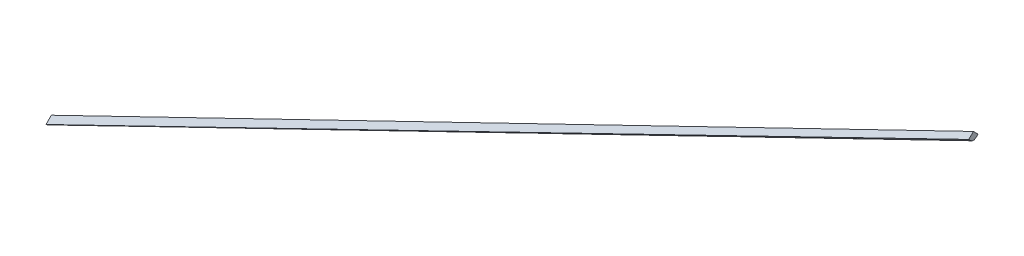
ISO-10303-21;
HEADER;
FILE_DESCRIPTION(('STEP AP214'),'2;1');
FILE_NAME('part.step','',(''),(''),'','','');
FILE_SCHEMA(('AUTOMOTIVE_DESIGN { 1 0 10303 214 1 1 1 1 }'));
ENDSEC;
DATA;
#1=APPLICATION_CONTEXT('core data for automotive mechanical design processes');
#2=APPLICATION_PROTOCOL_DEFINITION('international standard','automotive_design',2000,#1);
#3=PRODUCT_CONTEXT('',#1,'mechanical');
#4=PRODUCT('Part','Part','',(#3));
#5=PRODUCT_RELATED_PRODUCT_CATEGORY('part','',(#4));
#6=PRODUCT_DEFINITION_FORMATION('','',#4);
#7=PRODUCT_DEFINITION_CONTEXT('part definition',#1,'design');
#8=PRODUCT_DEFINITION('design','',#6,#7);
#9=PRODUCT_DEFINITION_SHAPE('','',#8);
#10=(LENGTH_UNIT() NAMED_UNIT(*) SI_UNIT(.MILLI.,.METRE.));
#11=(NAMED_UNIT(*) PLANE_ANGLE_UNIT() SI_UNIT($,.RADIAN.));
#12=(NAMED_UNIT(*) SI_UNIT($,.STERADIAN.) SOLID_ANGLE_UNIT());
#13=UNCERTAINTY_MEASURE_WITH_UNIT(LENGTH_MEASURE(1.E-05),#10,'distance_accuracy_value','');
#14=(GEOMETRIC_REPRESENTATION_CONTEXT(3) GLOBAL_UNCERTAINTY_ASSIGNED_CONTEXT((#13)) GLOBAL_UNIT_ASSIGNED_CONTEXT((#10,
#11,#12)) REPRESENTATION_CONTEXT('',''));
#15=CARTESIAN_POINT('',(0.,0.,0.));
#16=DIRECTION('',(0.,0.,1.));
#17=DIRECTION('',(1.,0.,0.));
#18=AXIS2_PLACEMENT_3D('',#15,#16,#17);
#19=CARTESIAN_POINT('',(0.,0.,0.));
#20=DIRECTION('',(-1.,0.,0.));
#21=DIRECTION('',(0.,0.,1.));
#22=AXIS2_PLACEMENT_3D('',#19,#20,#21);
#23=PLANE('',#22);
#24=DIRECTION('',(0.,-0.707106781186539,0.707106781186556));
#25=VECTOR('',#24,1.);
#26=CARTESIAN_POINT('',(0.,1.,0.));
#27=LINE('',#26,#25);
#28=CARTESIAN_POINT('',(0.,0.315862698021502,0.684137301919443));
#29=VERTEX_POINT('',#28);
#30=CARTESIAN_POINT('',(0.,1.,0.));
#31=VERTEX_POINT('',#30);
#32=EDGE_CURVE('E74',#29,#31,#27,.F.);
#33=ORIENTED_EDGE('',*,*,#32,.T.);
#34=DIRECTION('',(0.,-0.707106781186554,-0.707106781186541));
#35=VECTOR('',#34,1.);
#36=CARTESIAN_POINT('',(0.,1.,0.));
#37=LINE('',#36,#35);
#38=CARTESIAN_POINT('',(0.,0.31586269805103,-0.684137301948958));
#39=VERTEX_POINT('',#38);
#40=EDGE_CURVE('E92',#31,#39,#37,.T.);
#41=ORIENTED_EDGE('',*,*,#40,.T.);
#42=CARTESIAN_POINT('',(0.,114.4,0.));
#43=CARTESIAN_POINT('',(0.,114.4,0.0072838324299916));
#44=CARTESIAN_POINT('',(0.,114.211630690469,0.0218488366554333));
#45=CARTESIAN_POINT('',(0.,114.080118646882,0.0436282467660752));
#46=CARTESIAN_POINT('',(0.,113.796890954845,0.0795142857198553));
#47=CARTESIAN_POINT('',(0.,113.426193350975,0.128529824167782));
#48=CARTESIAN_POINT('',(0.,112.936855293923,0.189766940480201));
#49=CARTESIAN_POINT('',(0.,112.346166999731,0.26242898975721));
#50=CARTESIAN_POINT('',(0.,110.280049707971,0.510194469718378));
#51=CARTESIAN_POINT('',(0.,105.348652112069,1.03610984584126));
#52=CARTESIAN_POINT('',(0.,98.8040196091008,1.64696029330674));
#53=CARTESIAN_POINT('',(0.,89.5887480019146,2.43856623380089));
#54=CARTESIAN_POINT('',(0.,78.5982409417213,3.29258826974691));
#55=CARTESIAN_POINT('',(0.,64.5036725694726,4.21318410153266));
#56=CARTESIAN_POINT('',(0.,49.9099778334894,4.91417535466658));
#57=CARTESIAN_POINT('',(0.,38.9834810391131,5.16800984998526));
#58=CARTESIAN_POINT('',(0.,31.9372793334657,5.15962957711146));
#59=CARTESIAN_POINT('',(0.,28.6404540388475,5.11574905672803));
#60=CARTESIAN_POINT('',(0.,25.4659165086855,5.03886157181797));
#61=CARTESIAN_POINT('',(0.,21.5153111318161,4.88773266252852));
#62=CARTESIAN_POINT('',(0.,16.2443484888754,4.57614430828349));
#63=CARTESIAN_POINT('',(0.,11.3358377518641,4.06351264731328));
#64=CARTESIAN_POINT('',(0.,7.72888536307538,3.48002988666406));
#65=CARTESIAN_POINT('',(0.,5.96469851713171,3.13738551279787));
#66=CARTESIAN_POINT('',(0.,4.41708138247386,2.77256415689025));
#67=CARTESIAN_POINT('',(0.,3.09328338163604,2.37333821699482));
#68=CARTESIAN_POINT('',(0.,1.91416621401265,1.89926931885839));
#69=CARTESIAN_POINT('',(0.,1.05954476476886,1.39762010102772));
#70=CARTESIAN_POINT('',(0.,0.512892322559978,0.915140017273878));
#71=CARTESIAN_POINT('',(0.,0.262612740546847,0.629628981385082));
#72=CARTESIAN_POINT('',(0.,0.104439841482338,0.378528288285168));
#73=CARTESIAN_POINT('',(0.,0.0187876580989688,0.186587242264394));
#74=CARTESIAN_POINT('',(0.,-0.00614084997411463,0.));
#75=CARTESIAN_POINT('',(0.,0.0187876580989704,-0.186587242264419));
#76=CARTESIAN_POINT('',(0.,0.104439841482325,-0.378528288285144));
#77=CARTESIAN_POINT('',(0.,0.26261274054685,-0.629628981385088));
#78=CARTESIAN_POINT('',(0.,0.512892322560023,-0.915140017273927));
#79=CARTESIAN_POINT('',(0.,1.05954476476881,-1.39762010102767));
#80=CARTESIAN_POINT('',(0.,1.91416621401266,-1.8992693188584));
#81=CARTESIAN_POINT('',(0.,3.09328338163609,-2.37333821699484));
#82=CARTESIAN_POINT('',(0.,4.41708138247385,-2.77256415689025));
#83=CARTESIAN_POINT('',(0.,5.96469851713164,-3.13738551279786));
#84=CARTESIAN_POINT('',(0.,7.72888536307529,-3.48002988666405));
#85=CARTESIAN_POINT('',(0.,11.3358377518643,-4.06351264731332));
#86=CARTESIAN_POINT('',(0.,16.2443484888753,-4.57614430828348));
#87=CARTESIAN_POINT('',(0.,21.515311131816,-4.88773266252852));
#88=CARTESIAN_POINT('',(0.,25.4659165086855,-5.03886157181797));
#89=CARTESIAN_POINT('',(0.,28.6404540388475,-5.11574905672804));
#90=CARTESIAN_POINT('',(0.,31.9372793334656,-5.15962957711145));
#91=CARTESIAN_POINT('',(0.,38.9834810391131,-5.16800984998528));
#92=CARTESIAN_POINT('',(0.,49.9099778334897,-4.91417535466658));
#93=CARTESIAN_POINT('',(0.,64.5036725694725,-4.21318410153266));
#94=CARTESIAN_POINT('',(0.,78.5982409417211,-3.29258826974692));
#95=CARTESIAN_POINT('',(0.,89.5887480019146,-2.43856623380088));
#96=CARTESIAN_POINT('',(0.,98.8040196091008,-1.64696029330675));
#97=CARTESIAN_POINT('',(0.,105.348652112069,-1.03610984584126));
#98=CARTESIAN_POINT('',(0.,110.280049707971,-0.510194469718387));
#99=CARTESIAN_POINT('',(0.,112.346166999731,-0.262428989757209));
#100=CARTESIAN_POINT('',(0.,112.936855293923,-0.189766940480202));
#101=CARTESIAN_POINT('',(0.,113.426193350975,-0.12852982416778));
#102=CARTESIAN_POINT('',(0.,113.796890954845,-0.0795142857198586));
#103=CARTESIAN_POINT('',(0.,114.080118646882,-0.043628246766073));
#104=CARTESIAN_POINT('',(0.,114.211630690469,-0.0218488366554367));
#105=CARTESIAN_POINT('',(0.,114.4,-0.00728383242999128));
#106=CARTESIAN_POINT('',(0.,114.4,0.));
#107=B_SPLINE_CURVE_WITH_KNOTS('',3,(#42,#43,#44,#45,#46,#47,#48,#49,#50,#51,#52,#53,#54,#55,
#56,#57,#58,#59,#60,#61,#62,#63,#64,#65,#66,#67,#68,#69,#70,#71,#72,#73,#74,#75,#76,#77,#78,#79,
#80,#81,#82,#83,#84,#85,#86,#87,#88,#89,#90,#91,#92,#93,#94,#95,#96,#97,#98,#99,#100,#101,#102,
#103,#104,#105,#106),.UNSPECIFIED.,.T.,.F.,(4,1,1,1,1,1,1,1,1,1,1,1,1,1,1,1,1,1,1,1,1,1,1,1,1,1,
1,1,1,1,1,1,1,1,1,1,1,1,1,1,1,1,1,1,1,1,1,1,1,1,1,1,1,1,1,1,1,1,1,1,1,1,4),(0.,
0.000711185839146075,0.00142211189669677,0.00213325230730564,0.00425158120835251,
0.00636919832710723,0.00848752581630524,0.0119730784810977,0.0333165732602391,0.072750532853801,
0.097133324863051,0.153150736130299,0.215572756141474,0.280129489501461,0.342436877180773,
0.35716003719228,0.371419982611637,0.385154319352995,0.398301185339692,0.422640862362832,
0.453555830037826,0.462206438132531,0.469975829256052,0.476836911130722,0.482800105251618,
0.487877314409996,0.493276037135274,0.495568649395588,0.497302284253286,0.498179926351266,
0.499405098860122,0.5,0.500594901139878,0.501820073648735,0.502697715746714,0.504431350604412,
0.506723962864726,0.512122685590004,0.517199894748382,0.523163088869278,0.530024170743948,
0.537793561867469,0.546444169962174,0.577359137637168,0.601698814660308,0.614845680647005,
0.628580017388363,0.64283996280772,0.657563122819227,0.719870510498539,0.784427243858526,
0.846849263869701,0.902866675136949,0.927249467146199,0.966683426739761,0.988026921518902,
0.991512474183695,0.993630801672893,0.995748418791648,0.997866747692695,0.998577888103303,
0.999288814160854,1.),.UNSPECIFIED.);
#108=EDGE_CURVE('E66',#29,#39,#107,.T.);
#109=ORIENTED_EDGE('',*,*,#108,.F.);
#110=EDGE_LOOP('',(#33,#41,#109));
#111=FACE_BOUND('',#110,.T.);
#112=ADVANCED_FACE('F54',(#111),#23,.T.);
#113=CARTESIAN_POINT('',(118.,57.2,0.));
#114=DIRECTION('',(-1.,0.,0.));
#115=DIRECTION('',(0.,0.,1.));
#116=AXIS2_PLACEMENT_3D('',#113,#114,#115);
#117=PLANE('',#116);
#118=DIRECTION('',(0.,-0.707106781186554,-0.707106781186541));
#119=VECTOR('',#118,1.);
#120=CARTESIAN_POINT('',(118.,58.2,0.));
#121=LINE('',#120,#119);
#122=CARTESIAN_POINT('',(118.,58.2,0.));
#123=VERTEX_POINT('',#122);
#124=CARTESIAN_POINT('',(118.,57.6105345780877,-0.589465421912309));
#125=VERTEX_POINT('',#124);
#126=EDGE_CURVE('E104',#123,#125,#121,.T.);
#127=ORIENTED_EDGE('',*,*,#126,.F.);
#128=DIRECTION('',(0.,-0.707106781186539,0.707106781186556));
#129=VECTOR('',#128,1.);
#130=CARTESIAN_POINT('',(118.,58.2,0.));
#131=LINE('',#130,#129);
#132=CARTESIAN_POINT('',(118.,57.6105345780877,0.589465421912323));
#133=VERTEX_POINT('',#132);
#134=EDGE_CURVE('E12',#133,#123,#131,.F.);
#135=ORIENTED_EDGE('',*,*,#134,.F.);
#136=CARTESIAN_POINT('',(118.,114.4,0.));
#137=CARTESIAN_POINT('',(118.,114.4,0.0036419162149958));
#138=CARTESIAN_POINT('',(118.,114.305815345234,0.0109244183277166));
#139=CARTESIAN_POINT('',(118.,114.240059323441,0.0218141233830376));
#140=CARTESIAN_POINT('',(118.,114.098445477423,0.0397571428599277));
#141=CARTESIAN_POINT('',(118.,113.913096675488,0.0642649120838911));
#142=CARTESIAN_POINT('',(118.,113.668427646962,0.0948834702401005));
#143=CARTESIAN_POINT('',(118.,113.373083499866,0.131214494878605));
#144=CARTESIAN_POINT('',(118.,112.340024853985,0.255097234859189));
#145=CARTESIAN_POINT('',(118.,109.874326056034,0.518054922920632));
#146=CARTESIAN_POINT('',(118.,106.60200980455,0.823480146653369));
#147=CARTESIAN_POINT('',(118.,101.994374000957,1.21928311690045));
#148=CARTESIAN_POINT('',(118.,96.4991204708606,1.64629413487346));
#149=CARTESIAN_POINT('',(118.,89.4518362847363,2.10659205076633));
#150=CARTESIAN_POINT('',(118.,82.1549889167447,2.45708767733329));
#151=CARTESIAN_POINT('',(118.,76.6917405195565,2.58400492499263));
#152=CARTESIAN_POINT('',(118.,73.1686396667329,2.57981478855573));
#153=CARTESIAN_POINT('',(118.,71.5202270194238,2.55787452836402));
#154=CARTESIAN_POINT('',(118.,69.9329582543428,2.51943078590898));
#155=CARTESIAN_POINT('',(118.,67.957655565908,2.44386633126426));
#156=CARTESIAN_POINT('',(118.,65.3221742444377,2.28807215414175));
#157=CARTESIAN_POINT('',(118.,62.8679188759321,2.03175632365664));
#158=CARTESIAN_POINT('',(118.,61.0644426815377,1.74001494333203));
#159=CARTESIAN_POINT('',(118.,60.1823492585659,1.56869275639894));
#160=CARTESIAN_POINT('',(118.,59.4085406912369,1.38628207844513));
#161=CARTESIAN_POINT('',(118.,58.746641690818,1.18666910849741));
#162=CARTESIAN_POINT('',(118.,58.1570831070063,0.949634659429197));
#163=CARTESIAN_POINT('',(118.,57.7297723823844,0.69881005051386));
#164=CARTESIAN_POINT('',(118.,57.45644616128,0.457570008636939));
#165=CARTESIAN_POINT('',(118.,57.3313063702734,0.314814490692541));
#166=CARTESIAN_POINT('',(118.,57.2522199207412,0.189264144142584));
#167=CARTESIAN_POINT('',(118.,57.2093938290495,0.0932936211321971));
#168=CARTESIAN_POINT('',(118.,57.1969295750129,0.));
#169=CARTESIAN_POINT('',(118.,57.2093938290495,-0.0932936211322096));
#170=CARTESIAN_POINT('',(118.,57.2522199207412,-0.189264144142572));
#171=CARTESIAN_POINT('',(118.,57.3313063702734,-0.314814490692544));
#172=CARTESIAN_POINT('',(118.,57.45644616128,-0.457570008636963));
#173=CARTESIAN_POINT('',(118.,57.7297723823844,-0.698810050513834));
#174=CARTESIAN_POINT('',(118.,58.1570831070064,-0.9496346594292));
#175=CARTESIAN_POINT('',(118.,58.746641690818,-1.18666910849742));
#176=CARTESIAN_POINT('',(118.,59.4085406912369,-1.38628207844513));
#177=CARTESIAN_POINT('',(118.,60.1823492585658,-1.56869275639893));
#178=CARTESIAN_POINT('',(118.,61.0644426815376,-1.74001494333202));
#179=CARTESIAN_POINT('',(118.,62.8679188759322,-2.03175632365666));
#180=CARTESIAN_POINT('',(118.,65.3221742444378,-2.28807215414174));
#181=CARTESIAN_POINT('',(118.,67.957655565908,-2.44386633126426));
#182=CARTESIAN_POINT('',(118.,69.9329582543428,-2.51943078590898));
#183=CARTESIAN_POINT('',(118.,71.5202270194237,-2.55787452836402));
#184=CARTESIAN_POINT('',(118.,73.1686396667328,-2.57981478855572));
#185=CARTESIAN_POINT('',(118.,76.6917405195565,-2.58400492499264));
#186=CARTESIAN_POINT('',(118.,82.1549889167448,-2.45708767733329));
#187=CARTESIAN_POINT('',(118.,89.4518362847363,-2.10659205076633));
#188=CARTESIAN_POINT('',(118.,96.4991204708607,-1.64629413487346));
#189=CARTESIAN_POINT('',(118.,101.994374000957,-1.21928311690044));
#190=CARTESIAN_POINT('',(118.,106.60200980455,-0.823480146653373));
#191=CARTESIAN_POINT('',(118.,109.874326056035,-0.51805492292063));
#192=CARTESIAN_POINT('',(118.,112.340024853985,-0.255097234859193));
#193=CARTESIAN_POINT('',(118.,113.373083499866,-0.131214494878604));
#194=CARTESIAN_POINT('',(118.,113.668427646961,-0.0948834702401012));
#195=CARTESIAN_POINT('',(118.,113.913096675488,-0.0642649120838899));
#196=CARTESIAN_POINT('',(118.,114.098445477423,-0.0397571428599293));
#197=CARTESIAN_POINT('',(118.,114.240059323441,-0.0218141233830365));
#198=CARTESIAN_POINT('',(118.,114.305815345234,-0.0109244183277184));
#199=CARTESIAN_POINT('',(118.,114.4,-0.00364191621499564));
#200=CARTESIAN_POINT('',(118.,114.4,0.));
#201=B_SPLINE_CURVE_WITH_KNOTS('',3,(#136,#137,#138,#139,#140,#141,#142,#143,#144,#145,#146,
#147,#148,#149,#150,#151,#152,#153,#154,#155,#156,#157,#158,#159,#160,#161,#162,#163,#164,#165,
#166,#167,#168,#169,#170,#171,#172,#173,#174,#175,#176,#177,#178,#179,#180,#181,#182,#183,#184,
#185,#186,#187,#188,#189,#190,#191,#192,#193,#194,#195,#196,#197,#198,#199,#200),.UNSPECIFIED.,
.T.,.F.,(4,1,1,1,1,1,1,1,1,1,1,1,1,1,1,1,1,1,1,1,1,1,1,1,1,1,1,1,1,1,1,1,1,1,1,1,1,1,1,1,1,1,1,
1,1,1,1,1,1,1,1,1,1,1,1,1,1,1,1,1,1,1,4),(0.,0.000711185839146075,0.00142211189669677,
0.00213325230730564,0.00425158120835251,0.00636919832710723,0.00848752581630524,
0.0119730784810977,0.0333165732602391,0.072750532853801,0.097133324863051,0.153150736130299,
0.215572756141474,0.280129489501461,0.342436877180773,0.35716003719228,0.371419982611637,
0.385154319352995,0.398301185339692,0.422640862362832,0.453555830037826,0.462206438132531,
0.469975829256052,0.476836911130722,0.482800105251618,0.487877314409996,0.493276037135274,
0.495568649395588,0.497302284253286,0.498179926351266,0.499405098860122,0.5,0.500594901139878,
0.501820073648735,0.502697715746714,0.504431350604412,0.506723962864726,0.512122685590004,
0.517199894748382,0.523163088869278,0.530024170743948,0.537793561867469,0.546444169962174,
0.577359137637168,0.601698814660308,0.614845680647005,0.628580017388363,0.64283996280772,
0.657563122819227,0.719870510498539,0.784427243858526,0.846849263869701,0.902866675136949,
0.927249467146199,0.966683426739761,0.988026921518902,0.991512474183695,0.993630801672893,
0.995748418791648,0.997866747692695,0.998577888103303,0.999288814160854,1.),.UNSPECIFIED.);
#202=EDGE_CURVE('E58',#133,#125,#201,.T.);
#203=ORIENTED_EDGE('',*,*,#202,.T.);
#204=EDGE_LOOP('',(#127,#135,#203));
#205=FACE_BOUND('',#204,.T.);
#206=ADVANCED_FACE('F56',(#205),#117,.F.);
#207=CARTESIAN_POINT('',(0.,114.4,0.));
#208=CARTESIAN_POINT('',(118.,114.4,0.));
#209=CARTESIAN_POINT('',(0.,114.4,0.0072838324299916));
#210=CARTESIAN_POINT('',(118.,114.4,0.0036419162149958));
#211=CARTESIAN_POINT('',(0.,114.211630690469,0.0218488366554333));
#212=CARTESIAN_POINT('',(118.,114.305815345234,0.0109244183277166));
#213=CARTESIAN_POINT('',(0.,114.080118646882,0.0436282467660752));
#214=CARTESIAN_POINT('',(118.,114.240059323441,0.0218141233830376));
#215=CARTESIAN_POINT('',(0.,113.796890954845,0.0795142857198553));
#216=CARTESIAN_POINT('',(118.,114.098445477423,0.0397571428599277));
#217=CARTESIAN_POINT('',(0.,113.426193350975,0.128529824167782));
#218=CARTESIAN_POINT('',(118.,113.913096675488,0.0642649120838911));
#219=CARTESIAN_POINT('',(0.,112.936855293923,0.189766940480201));
#220=CARTESIAN_POINT('',(118.,113.668427646962,0.0948834702401005));
#221=CARTESIAN_POINT('',(0.,112.346166999731,0.26242898975721));
#222=CARTESIAN_POINT('',(118.,113.373083499866,0.131214494878605));
#223=CARTESIAN_POINT('',(0.,110.280049707971,0.510194469718378));
#224=CARTESIAN_POINT('',(118.,112.340024853985,0.255097234859189));
#225=CARTESIAN_POINT('',(0.,105.348652112069,1.03610984584126));
#226=CARTESIAN_POINT('',(118.,109.874326056034,0.518054922920632));
#227=CARTESIAN_POINT('',(0.,98.8040196091008,1.64696029330674));
#228=CARTESIAN_POINT('',(118.,106.60200980455,0.823480146653369));
#229=CARTESIAN_POINT('',(0.,89.5887480019146,2.43856623380089));
#230=CARTESIAN_POINT('',(118.,101.994374000957,1.21928311690045));
#231=CARTESIAN_POINT('',(0.,78.5982409417213,3.29258826974691));
#232=CARTESIAN_POINT('',(118.,96.4991204708606,1.64629413487346));
#233=CARTESIAN_POINT('',(0.,64.5036725694726,4.21318410153266));
#234=CARTESIAN_POINT('',(118.,89.4518362847363,2.10659205076633));
#235=CARTESIAN_POINT('',(0.,49.9099778334894,4.91417535466658));
#236=CARTESIAN_POINT('',(118.,82.1549889167447,2.45708767733329));
#237=CARTESIAN_POINT('',(0.,38.9834810391131,5.16800984998526));
#238=CARTESIAN_POINT('',(118.,76.6917405195565,2.58400492499263));
#239=CARTESIAN_POINT('',(0.,31.9372793334657,5.15962957711146));
#240=CARTESIAN_POINT('',(118.,73.1686396667329,2.57981478855573));
#241=CARTESIAN_POINT('',(0.,28.6404540388475,5.11574905672803));
#242=CARTESIAN_POINT('',(118.,71.5202270194238,2.55787452836402));
#243=CARTESIAN_POINT('',(0.,25.4659165086855,5.03886157181797));
#244=CARTESIAN_POINT('',(118.,69.9329582543428,2.51943078590898));
#245=CARTESIAN_POINT('',(0.,21.5153111318161,4.88773266252852));
#246=CARTESIAN_POINT('',(118.,67.957655565908,2.44386633126426));
#247=CARTESIAN_POINT('',(0.,16.2443484888754,4.57614430828349));
#248=CARTESIAN_POINT('',(118.,65.3221742444377,2.28807215414175));
#249=CARTESIAN_POINT('',(0.,11.3358377518641,4.06351264731328));
#250=CARTESIAN_POINT('',(118.,62.8679188759321,2.03175632365664));
#251=CARTESIAN_POINT('',(0.,7.72888536307538,3.48002988666406));
#252=CARTESIAN_POINT('',(118.,61.0644426815377,1.74001494333203));
#253=CARTESIAN_POINT('',(0.,5.96469851713171,3.13738551279787));
#254=CARTESIAN_POINT('',(118.,60.1823492585659,1.56869275639894));
#255=CARTESIAN_POINT('',(0.,4.41708138247386,2.77256415689025));
#256=CARTESIAN_POINT('',(118.,59.4085406912369,1.38628207844513));
#257=CARTESIAN_POINT('',(0.,3.09328338163604,2.37333821699482));
#258=CARTESIAN_POINT('',(118.,58.746641690818,1.18666910849741));
#259=CARTESIAN_POINT('',(0.,1.91416621401265,1.89926931885839));
#260=CARTESIAN_POINT('',(118.,58.1570831070063,0.949634659429197));
#261=CARTESIAN_POINT('',(0.,1.05954476476886,1.39762010102772));
#262=CARTESIAN_POINT('',(118.,57.7297723823844,0.69881005051386));
#263=CARTESIAN_POINT('',(0.,0.512892322559978,0.915140017273878));
#264=CARTESIAN_POINT('',(118.,57.45644616128,0.457570008636939));
#265=CARTESIAN_POINT('',(0.,0.262612740546847,0.629628981385082));
#266=CARTESIAN_POINT('',(118.,57.3313063702734,0.314814490692541));
#267=CARTESIAN_POINT('',(0.,0.104439841482338,0.378528288285168));
#268=CARTESIAN_POINT('',(118.,57.2522199207412,0.189264144142584));
#269=CARTESIAN_POINT('',(0.,0.0187876580989688,0.186587242264394));
#270=CARTESIAN_POINT('',(118.,57.2093938290495,0.0932936211321971));
#271=CARTESIAN_POINT('',(0.,-0.00614084997411463,0.));
#272=CARTESIAN_POINT('',(118.,57.1969295750129,0.));
#273=CARTESIAN_POINT('',(0.,0.0187876580989704,-0.186587242264419));
#274=CARTESIAN_POINT('',(118.,57.2093938290495,-0.0932936211322096));
#275=CARTESIAN_POINT('',(0.,0.104439841482325,-0.378528288285144));
#276=CARTESIAN_POINT('',(118.,57.2522199207412,-0.189264144142572));
#277=CARTESIAN_POINT('',(0.,0.26261274054685,-0.629628981385088));
#278=CARTESIAN_POINT('',(118.,57.3313063702734,-0.314814490692544));
#279=CARTESIAN_POINT('',(0.,0.512892322560023,-0.915140017273927));
#280=CARTESIAN_POINT('',(118.,57.45644616128,-0.457570008636963));
#281=CARTESIAN_POINT('',(0.,1.05954476476881,-1.39762010102767));
#282=CARTESIAN_POINT('',(118.,57.7297723823844,-0.698810050513834));
#283=CARTESIAN_POINT('',(0.,1.91416621401266,-1.8992693188584));
#284=CARTESIAN_POINT('',(118.,58.1570831070064,-0.9496346594292));
#285=CARTESIAN_POINT('',(0.,3.09328338163609,-2.37333821699484));
#286=CARTESIAN_POINT('',(118.,58.746641690818,-1.18666910849742));
#287=CARTESIAN_POINT('',(0.,4.41708138247385,-2.77256415689025));
#288=CARTESIAN_POINT('',(118.,59.4085406912369,-1.38628207844513));
#289=CARTESIAN_POINT('',(0.,5.96469851713164,-3.13738551279786));
#290=CARTESIAN_POINT('',(118.,60.1823492585658,-1.56869275639893));
#291=CARTESIAN_POINT('',(0.,7.72888536307529,-3.48002988666405));
#292=CARTESIAN_POINT('',(118.,61.0644426815376,-1.74001494333202));
#293=CARTESIAN_POINT('',(0.,11.3358377518643,-4.06351264731332));
#294=CARTESIAN_POINT('',(118.,62.8679188759322,-2.03175632365666));
#295=CARTESIAN_POINT('',(0.,16.2443484888753,-4.57614430828348));
#296=CARTESIAN_POINT('',(118.,65.3221742444378,-2.28807215414174));
#297=CARTESIAN_POINT('',(0.,21.515311131816,-4.88773266252852));
#298=CARTESIAN_POINT('',(118.,67.957655565908,-2.44386633126426));
#299=CARTESIAN_POINT('',(0.,25.4659165086855,-5.03886157181797));
#300=CARTESIAN_POINT('',(118.,69.9329582543428,-2.51943078590898));
#301=CARTESIAN_POINT('',(0.,28.6404540388475,-5.11574905672804));
#302=CARTESIAN_POINT('',(118.,71.5202270194237,-2.55787452836402));
#303=CARTESIAN_POINT('',(0.,31.9372793334656,-5.15962957711145));
#304=CARTESIAN_POINT('',(118.,73.1686396667328,-2.57981478855572));
#305=CARTESIAN_POINT('',(0.,38.9834810391131,-5.16800984998528));
#306=CARTESIAN_POINT('',(118.,76.6917405195565,-2.58400492499264));
#307=CARTESIAN_POINT('',(0.,49.9099778334897,-4.91417535466658));
#308=CARTESIAN_POINT('',(118.,82.1549889167448,-2.45708767733329));
#309=CARTESIAN_POINT('',(0.,64.5036725694725,-4.21318410153266));
#310=CARTESIAN_POINT('',(118.,89.4518362847363,-2.10659205076633));
#311=CARTESIAN_POINT('',(0.,78.5982409417211,-3.29258826974692));
#312=CARTESIAN_POINT('',(118.,96.4991204708607,-1.64629413487346));
#313=CARTESIAN_POINT('',(0.,89.5887480019146,-2.43856623380088));
#314=CARTESIAN_POINT('',(118.,101.994374000957,-1.21928311690044));
#315=CARTESIAN_POINT('',(0.,98.8040196091008,-1.64696029330675));
#316=CARTESIAN_POINT('',(118.,106.60200980455,-0.823480146653373));
#317=CARTESIAN_POINT('',(0.,105.348652112069,-1.03610984584126));
#318=CARTESIAN_POINT('',(118.,109.874326056035,-0.51805492292063));
#319=CARTESIAN_POINT('',(0.,110.280049707971,-0.510194469718387));
#320=CARTESIAN_POINT('',(118.,112.340024853985,-0.255097234859193));
#321=CARTESIAN_POINT('',(0.,112.346166999731,-0.262428989757209));
#322=CARTESIAN_POINT('',(118.,113.373083499866,-0.131214494878604));
#323=CARTESIAN_POINT('',(0.,112.936855293923,-0.189766940480202));
#324=CARTESIAN_POINT('',(118.,113.668427646961,-0.0948834702401012));
#325=CARTESIAN_POINT('',(0.,113.426193350975,-0.12852982416778));
#326=CARTESIAN_POINT('',(118.,113.913096675488,-0.0642649120838899));
#327=CARTESIAN_POINT('',(0.,113.796890954845,-0.0795142857198586));
#328=CARTESIAN_POINT('',(118.,114.098445477423,-0.0397571428599293));
#329=CARTESIAN_POINT('',(0.,114.080118646882,-0.043628246766073));
#330=CARTESIAN_POINT('',(118.,114.240059323441,-0.0218141233830365));
#331=CARTESIAN_POINT('',(0.,114.211630690469,-0.0218488366554367));
#332=CARTESIAN_POINT('',(118.,114.305815345234,-0.0109244183277184));
#333=CARTESIAN_POINT('',(0.,114.4,-0.00728383242999128));
#334=CARTESIAN_POINT('',(118.,114.4,-0.00364191621499564));
#335=CARTESIAN_POINT('',(0.,114.4,0.));
#336=CARTESIAN_POINT('',(118.,114.4,0.));
#337=B_SPLINE_SURFACE_WITH_KNOTS('',3,1,((#207,#208),(#209,#210),(#211,#212),(#213,#214),(#215,
#216),(#217,#218),(#219,#220),(#221,#222),(#223,#224),(#225,#226),(#227,#228),(#229,#230),(#231,
#232),(#233,#234),(#235,#236),(#237,#238),(#239,#240),(#241,#242),(#243,#244),(#245,#246),(#247,
#248),(#249,#250),(#251,#252),(#253,#254),(#255,#256),(#257,#258),(#259,#260),(#261,#262),(#263,
#264),(#265,#266),(#267,#268),(#269,#270),(#271,#272),(#273,#274),(#275,#276),(#277,#278),(#279,
#280),(#281,#282),(#283,#284),(#285,#286),(#287,#288),(#289,#290),(#291,#292),(#293,#294),(#295,
#296),(#297,#298),(#299,#300),(#301,#302),(#303,#304),(#305,#306),(#307,#308),(#309,#310),(#311,
#312),(#313,#314),(#315,#316),(#317,#318),(#319,#320),(#321,#322),(#323,#324),(#325,#326),(#327,
#328),(#329,#330),(#331,#332),(#333,#334),(#335,#336)),.UNSPECIFIED.,.T.,.F.,.F.,(4,1,1,1,1,1,1,
1,1,1,1,1,1,1,1,1,1,1,1,1,1,1,1,1,1,1,1,1,1,1,1,1,1,1,1,1,1,1,1,1,1,1,1,1,1,1,1,1,1,1,1,1,1,1,1,
1,1,1,1,1,1,1,4),(2,2),(0.,0.000711185839146075,0.00142211189669677,0.00213325230730564,
0.00425158120835251,0.00636919832710723,0.00848752581630524,0.0119730784810977,
0.0333165732602391,0.072750532853801,0.097133324863051,0.153150736130299,0.215572756141474,
0.280129489501461,0.342436877180773,0.35716003719228,0.371419982611637,0.385154319352995,
0.398301185339692,0.422640862362832,0.453555830037826,0.462206438132531,0.469975829256052,
0.476836911130722,0.482800105251618,0.487877314409996,0.493276037135274,0.495568649395588,
0.497302284253286,0.498179926351266,0.499405098860122,0.5,0.500594901139878,0.501820073648735,
0.502697715746714,0.504431350604412,0.506723962864726,0.512122685590004,0.517199894748382,
0.523163088869278,0.530024170743948,0.537793561867469,0.546444169962174,0.577359137637168,
0.601698814660308,0.614845680647005,0.628580017388363,0.64283996280772,0.657563122819227,
0.719870510498539,0.784427243858526,0.846849263869701,0.902866675136949,0.927249467146199,
0.966683426739761,0.988026921518902,0.991512474183695,0.993630801672893,0.995748418791648,
0.997866747692695,0.998577888103303,0.999288814160854,1.),(0.,1.),.UNSPECIFIED.);
#338=CARTESIAN_POINT('',(117.999999999886,57.6105345777966,-0.589465421621769));
#339=CARTESIAN_POINT('',(117.689845977831,57.4598198616952,-0.589834289979784));
#340=CARTESIAN_POINT('',(117.37969129331,57.3091065047773,-0.590201477961144));
#341=CARTESIAN_POINT('',(115.894864199745,56.5875928865141,-0.591951454834035));
#342=CARTESIAN_POINT('',(114.720183124681,56.0168104058975,-0.593312261507953));
#343=CARTESIAN_POINT('',(108.846734699955,53.1629863066587,-0.600007123418974));
#344=CARTESIAN_POINT('',(104.147838246351,50.8802096210914,-0.605013664227674));
#345=CARTESIAN_POINT('',(94.7498356481534,46.3150868750193,-0.614494473268937));
#346=CARTESIAN_POINT('',(90.0507295035591,44.0327408145139,-0.618968741502244));
#347=CARTESIAN_POINT('',(80.6523529884687,39.4683860853908,-0.627500278457363));
#348=CARTESIAN_POINT('',(75.9530826179727,37.1863774167729,-0.631557547179499));
#349=CARTESIAN_POINT('',(66.5544124733529,32.6226260261974,-0.639343410052131));
#350=CARTESIAN_POINT('',(61.855012699229,30.3408833042396,-0.643072004202774));
#351=CARTESIAN_POINT('',(54.8058303065949,26.9184393004542,-0.648454712571855));
#352=CARTESIAN_POINT('',(52.4560890545601,25.7776529794157,-0.650213918218206));
#353=CARTESIAN_POINT('',(47.7565796233362,23.4961356987186,-0.653663915305712));
#354=CARTESIAN_POINT('',(45.4068114441472,22.3554047390601,-0.655354706746869));
#355=CARTESIAN_POINT('',(40.7072496059654,20.0739952126854,-0.658671545460431));
#356=CARTESIAN_POINT('',(38.3574559469727,18.9333166459691,-0.660297592732838));
#357=CARTESIAN_POINT('',(33.6578443979145,16.6520093440549,-0.663488109849447));
#358=CARTESIAN_POINT('',(31.3080265078491,15.5113806088569,-0.66505257969365));
#359=CARTESIAN_POINT('',(24.3396327128794,12.1289282642501,-0.669605559281279));
#360=CARTESIAN_POINT('',(19.7210239701246,9.8871721927395,-0.672510613117484));
#361=CARTESIAN_POINT('',(12.7930154923674,6.52464333906575,-0.67671671316659));
#362=CARTESIAN_POINT('',(10.4836455571273,5.40380925178421,-0.678093509806282));
#363=CARTESIAN_POINT('',(5.86485394560602,3.16216379691043,-0.680799302146036));
#364=CARTESIAN_POINT('',(3.5554322690567,2.04135242987004,-0.682128297164217));
#365=CARTESIAN_POINT('',(0.830668082387281,0.718993224991782,-0.683669608165439));
#366=CARTESIAN_POINT('',(0.415334183634685,0.517427668427132,-0.68390381719917));
#367=CARTESIAN_POINT('',(0.,0.31586269804799,-0.684137301952009));
#368=B_SPLINE_CURVE_WITH_KNOTS('',3,(#338,#339,#340,#341,#342,#343,#344,#345,#346,#347,#348,
#349,#350,#351,#352,#353,#354,#355,#356,#357,#358,#359,#360,#361,#362,#363,#364,#365,#366,#367),
.UNSPECIFIED.,.F.,.F.,(4,2,2,2,2,2,2,2,2,2,2,2,2,2,4),(0.,1.0345023982359,4.95254158525062,
20.624698382552,36.2968551579261,51.9690119211284,67.6411686773549,75.4772470504573,
83.3133254234462,91.1494037963239,98.9854821690964,114.387210276092,122.088193589473,
129.789286712334,131.174270027427),.UNSPECIFIED.);
#369=EDGE_CURVE('E82',#125,#39,#368,.T.);
#370=CARTESIAN_POINT('',(-6.35107477827328E-12,0.315862698034831,0.684137301932825));
#371=CARTESIAN_POINT('',(0.340948613902556,0.481327761763875,0.683945634111686));
#372=CARTESIAN_POINT('',(0.681897035739623,0.646793220701086,0.683753477972779));
#373=CARTESIAN_POINT('',(2.38663817663475,1.47412250780308,0.682790235473865));
#374=CARTESIAN_POINT('',(3.75042799072617,2.13599231316908,0.682011763700786));
#375=CARTESIAN_POINT('',(7.84178783155654,4.12162148462981,0.679651938783976));
#376=CARTESIAN_POINT('',(10.5693482566224,5.44540060597606,0.678046176042803));
#377=CARTESIAN_POINT('',(16.0244417793871,8.0930150677049,0.674765184680917));
#378=CARTESIAN_POINT('',(18.7519748770859,9.41685040808748,0.673089956060202));
#379=CARTESIAN_POINT('',(22.8432526509832,11.4026484096099,0.670521519510357));
#380=CARTESIAN_POINT('',(24.207008263446,12.0645885752458,0.669656108390653));
#381=CARTESIAN_POINT('',(28.2982638085202,14.0504322998495,0.667031173433505));
#382=CARTESIAN_POINT('',(31.025752448501,15.37435908636,0.665242947998216));
#383=CARTESIAN_POINT('',(36.4806976484799,18.022278634504,0.661584971369258));
#384=CARTESIAN_POINT('',(39.2081542084779,19.3462713961375,0.659715220175586));
#385=CARTESIAN_POINT('',(44.6630332452703,21.9943270045016,0.655889111002414));
#386=CARTESIAN_POINT('',(47.3904557220647,23.3183898512322,0.653932753022911));
#387=CARTESIAN_POINT('',(52.8452645134295,25.966589893993,0.649928158279627));
#388=CARTESIAN_POINT('',(55.572650828,27.2907270900232,0.647879921515844));
#389=CARTESIAN_POINT('',(61.0273855895766,29.939079323709,0.643687250221352));
#390=CARTESIAN_POINT('',(63.7547340365826,31.2632943613647,0.641542815690642));
#391=CARTESIAN_POINT('',(71.9367185027171,35.2360646123559,0.634954865232395));
#392=CARTESIAN_POINT('',(77.3912936413229,37.8847449609782,0.630356702442859));
#393=CARTESIAN_POINT('',(87.9624653753797,43.0185082567822,0.620924111622101));
#394=CARTESIAN_POINT('',(93.0790746765624,45.5035650998654,0.616121946739067));
#395=CARTESIAN_POINT('',(103.312159136952,50.4742292019651,0.605902176286748));
#396=CARTESIAN_POINT('',(108.42863429103,52.9598364715159,0.600484557696663));
#397=CARTESIAN_POINT('',(115.029978012637,56.1673355354308,0.592958891033546));
#398=CARTESIAN_POINT('',(116.514996417256,56.8889198512444,0.591230954407496));
#399=CARTESIAN_POINT('',(118.,57.6105345781399,0.589465421858169));
#400=B_SPLINE_CURVE_WITH_KNOTS('',3,(#370,#371,#372,#373,#374,#375,#376,#377,#378,#379,#380,
#381,#382,#383,#384,#385,#386,#387,#388,#389,#390,#391,#392,#393,#394,#395,#396,#397,#398,#399),
.UNSPECIFIED.,.F.,.F.,(4,2,2,2,2,2,2,2,2,2,2,2,2,2,4),(0.,1.13693541259003,5.68467706305684,
14.7801603647546,23.8756436665901,28.4233853171005,37.5188686191756,46.6143519214326,
55.7098352238862,64.805318526545,73.9008018294119,92.091768453951,109.156263480233,
126.221119597482,131.174270022646),.UNSPECIFIED.);
#401=EDGE_CURVE('E110',#29,#133,#400,.T.);
#402=ORIENTED_EDGE('',*,*,#369,.F.);
#403=ORIENTED_EDGE('',*,*,#202,.F.);
#404=ORIENTED_EDGE('',*,*,#401,.F.);
#405=ORIENTED_EDGE('',*,*,#108,.T.);
#406=EDGE_LOOP('',(#402,#403,#404,#405));
#407=FACE_BOUND('',#406,.T.);
#408=ADVANCED_FACE('F124',(#407),#337,.T.);
#409=CARTESIAN_POINT('',(0.,1.,0.));
#410=DIRECTION('',(0.324248033665072,-0.668903286232142,0.668903286232154));
#411=DIRECTION('',(0.,-0.707106781186554,-0.707106781186541));
#412=AXIS2_PLACEMENT_3D('',#409,#410,#411);
#413=PLANE('',#412);
#414=ORIENTED_EDGE('',*,*,#369,.T.);
#415=ORIENTED_EDGE('',*,*,#40,.F.);
#416=DIRECTION('',(0.899850390659934,0.436198663947019,0.));
#417=VECTOR('',#416,1.);
#418=CARTESIAN_POINT('',(0.,1.,0.));
#419=LINE('',#418,#417);
#420=EDGE_CURVE('E94',#31,#123,#419,.T.);
#421=ORIENTED_EDGE('',*,*,#420,.T.);
#422=ORIENTED_EDGE('',*,*,#126,.T.);
#423=EDGE_LOOP('',(#414,#415,#421,#422));
#424=FACE_BOUND('',#423,.T.);
#425=ADVANCED_FACE('F93',(#424),#413,.F.);
#426=CARTESIAN_POINT('',(0.,1.,0.));
#427=DIRECTION('',(0.324248033665078,-0.668903286232155,-0.668903286232138));
#428=DIRECTION('',(0.,0.707106781186539,-0.707106781186556));
#429=AXIS2_PLACEMENT_3D('',#426,#427,#428);
#430=PLANE('',#429);
#431=ORIENTED_EDGE('',*,*,#401,.T.);
#432=ORIENTED_EDGE('',*,*,#134,.T.);
#433=ORIENTED_EDGE('',*,*,#420,.F.);
#434=ORIENTED_EDGE('',*,*,#32,.F.);
#435=EDGE_LOOP('',(#431,#432,#433,#434));
#436=FACE_BOUND('',#435,.T.);
#437=ADVANCED_FACE('F101',(#436),#430,.F.);
#438=CLOSED_SHELL('',(#112,#206,#408,#425,#437));
#439=MANIFOLD_SOLID_BREP('B2',#438);
#440=ADVANCED_BREP_SHAPE_REPRESENTATION('',(#18,#439),#14);
#441=SHAPE_DEFINITION_REPRESENTATION(#9,#440);
ENDSEC;
END-ISO-10303-21;
